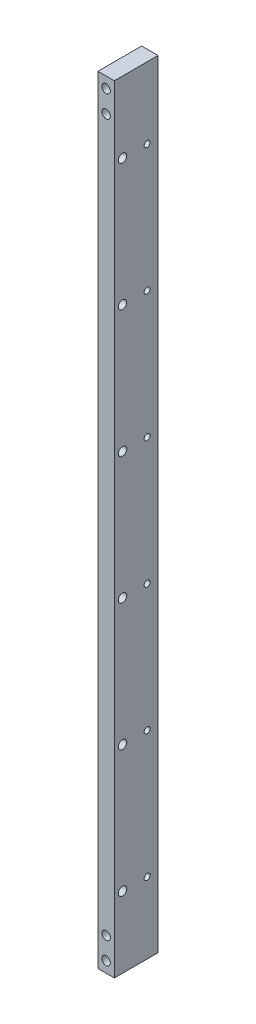
ISO-10303-21;
HEADER;
FILE_DESCRIPTION(('STEP AP214'),'2;1');
FILE_NAME('part.step','',(''),(''),'','','');
FILE_SCHEMA(('AUTOMOTIVE_DESIGN { 1 0 10303 214 1 1 1 1 }'));
ENDSEC;
DATA;
#1=APPLICATION_CONTEXT('core data for automotive mechanical design processes');
#2=APPLICATION_PROTOCOL_DEFINITION('international standard','automotive_design',2000,#1);
#3=PRODUCT_CONTEXT('',#1,'mechanical');
#4=PRODUCT('Part','Part','',(#3));
#5=PRODUCT_RELATED_PRODUCT_CATEGORY('part','',(#4));
#6=PRODUCT_DEFINITION_FORMATION('','',#4);
#7=PRODUCT_DEFINITION_CONTEXT('part definition',#1,'design');
#8=PRODUCT_DEFINITION('design','',#6,#7);
#9=PRODUCT_DEFINITION_SHAPE('','',#8);
#10=(LENGTH_UNIT() NAMED_UNIT(*) SI_UNIT(.MILLI.,.METRE.));
#11=(NAMED_UNIT(*) PLANE_ANGLE_UNIT() SI_UNIT($,.RADIAN.));
#12=(NAMED_UNIT(*) SI_UNIT($,.STERADIAN.) SOLID_ANGLE_UNIT());
#13=UNCERTAINTY_MEASURE_WITH_UNIT(LENGTH_MEASURE(1.E-05),#10,'distance_accuracy_value','');
#14=(GEOMETRIC_REPRESENTATION_CONTEXT(3) GLOBAL_UNCERTAINTY_ASSIGNED_CONTEXT((#13)) GLOBAL_UNIT_ASSIGNED_CONTEXT((#10,
#11,#12)) REPRESENTATION_CONTEXT('',''));
#15=CARTESIAN_POINT('',(0.,0.,0.));
#16=DIRECTION('',(0.,0.,1.));
#17=DIRECTION('',(1.,0.,0.));
#18=AXIS2_PLACEMENT_3D('',#15,#16,#17);
#19=CARTESIAN_POINT('',(-12.9743902977286,450.85,-10.5416921169045));
#20=DIRECTION('',(1.,0.,0.));
#21=DIRECTION('',(0.,0.,-1.));
#22=AXIS2_PLACEMENT_3D('',#19,#20,#21);
#23=PLANE('',#22);
#24=CARTESIAN_POINT('',(-12.9743902977286,41.275,-4.19169211690451));
#25=DIRECTION('',(-1.,0.,0.));
#26=DIRECTION('',(0.,0.,1.));
#27=AXIS2_PLACEMENT_3D('',#24,#25,#26);
#28=CIRCLE('',#27,1.72719999999998);
#29=CARTESIAN_POINT('',(-12.9743902977286,41.275,-2.46449211690452));
#30=VERTEX_POINT('',#29);
#31=EDGE_CURVE('E266',#30,#30,#28,.T.);
#32=ORIENTED_EDGE('',*,*,#31,.F.);
#33=EDGE_LOOP('',(#32));
#34=FACE_BOUND('',#33,.T.);
#35=CARTESIAN_POINT('',(-12.9743902977286,114.935,-4.19169211690451));
#36=DIRECTION('',(-1.,0.,0.));
#37=DIRECTION('',(0.,0.,1.));
#38=AXIS2_PLACEMENT_3D('',#35,#36,#37);
#39=CIRCLE('',#38,1.72719999999998);
#40=CARTESIAN_POINT('',(-12.9743902977286,114.935,-2.46449211690452));
#41=VERTEX_POINT('',#40);
#42=EDGE_CURVE('E260',#41,#41,#39,.T.);
#43=ORIENTED_EDGE('',*,*,#42,.F.);
#44=EDGE_LOOP('',(#43));
#45=FACE_BOUND('',#44,.T.);
#46=CARTESIAN_POINT('',(-12.9743902977286,188.595,-4.19169211690451));
#47=DIRECTION('',(-1.,0.,0.));
#48=DIRECTION('',(0.,0.,1.));
#49=AXIS2_PLACEMENT_3D('',#46,#47,#48);
#50=CIRCLE('',#49,1.72719999999998);
#51=CARTESIAN_POINT('',(-12.9743902977286,188.595,-2.46449211690452));
#52=VERTEX_POINT('',#51);
#53=EDGE_CURVE('E254',#52,#52,#50,.T.);
#54=ORIENTED_EDGE('',*,*,#53,.F.);
#55=EDGE_LOOP('',(#54));
#56=FACE_BOUND('',#55,.T.);
#57=CARTESIAN_POINT('',(-12.9743902977286,262.255,-4.19169211690451));
#58=DIRECTION('',(-1.,0.,0.));
#59=DIRECTION('',(0.,0.,1.));
#60=AXIS2_PLACEMENT_3D('',#57,#58,#59);
#61=CIRCLE('',#60,1.72719999999998);
#62=CARTESIAN_POINT('',(-12.9743902977286,262.255,-2.46449211690452));
#63=VERTEX_POINT('',#62);
#64=EDGE_CURVE('E248',#63,#63,#61,.T.);
#65=ORIENTED_EDGE('',*,*,#64,.F.);
#66=EDGE_LOOP('',(#65));
#67=FACE_BOUND('',#66,.T.);
#68=CARTESIAN_POINT('',(-12.9743902977286,335.915,-4.19169211690451));
#69=DIRECTION('',(-1.,0.,0.));
#70=DIRECTION('',(0.,0.,1.));
#71=AXIS2_PLACEMENT_3D('',#68,#69,#70);
#72=CIRCLE('',#71,1.72719999999998);
#73=CARTESIAN_POINT('',(-12.9743902977286,335.915,-2.46449211690452));
#74=VERTEX_POINT('',#73);
#75=EDGE_CURVE('E242',#74,#74,#72,.T.);
#76=ORIENTED_EDGE('',*,*,#75,.F.);
#77=EDGE_LOOP('',(#76));
#78=FACE_BOUND('',#77,.T.);
#79=CARTESIAN_POINT('',(-12.9743902977286,409.575,-4.19169211690451));
#80=DIRECTION('',(-1.,0.,0.));
#81=DIRECTION('',(0.,0.,1.));
#82=AXIS2_PLACEMENT_3D('',#79,#80,#81);
#83=CIRCLE('',#82,1.72719999999998);
#84=CARTESIAN_POINT('',(-12.9743902977286,409.575,-2.46449211690452));
#85=VERTEX_POINT('',#84);
#86=EDGE_CURVE('E236',#85,#85,#83,.T.);
#87=ORIENTED_EDGE('',*,*,#86,.F.);
#88=EDGE_LOOP('',(#87));
#89=FACE_BOUND('',#88,.T.);
#90=CARTESIAN_POINT('',(-12.9743902977286,41.275,10.0958078830955));
#91=DIRECTION('',(-1.,0.,0.));
#92=DIRECTION('',(0.,0.,1.));
#93=AXIS2_PLACEMENT_3D('',#90,#91,#92);
#94=CIRCLE('',#93,3.96875);
#95=CARTESIAN_POINT('',(-12.9743902977286,41.275,14.0645578830955));
#96=VERTEX_POINT('',#95);
#97=EDGE_CURVE('E182',#96,#96,#94,.T.);
#98=ORIENTED_EDGE('',*,*,#97,.F.);
#99=EDGE_LOOP('',(#98));
#100=FACE_BOUND('',#99,.T.);
#101=CARTESIAN_POINT('',(-12.9743902977286,114.935,10.0958078830955));
#102=DIRECTION('',(-1.,0.,0.));
#103=DIRECTION('',(0.,0.,1.));
#104=AXIS2_PLACEMENT_3D('',#101,#102,#103);
#105=CIRCLE('',#104,3.96874999999999);
#106=CARTESIAN_POINT('',(-12.9743902977286,114.935,14.0645578830955));
#107=VERTEX_POINT('',#106);
#108=EDGE_CURVE('E170',#107,#107,#105,.T.);
#109=ORIENTED_EDGE('',*,*,#108,.F.);
#110=EDGE_LOOP('',(#109));
#111=FACE_BOUND('',#110,.T.);
#112=CARTESIAN_POINT('',(-12.9743902977286,188.595,10.0958078830955));
#113=DIRECTION('',(-1.,0.,0.));
#114=DIRECTION('',(0.,0.,1.));
#115=AXIS2_PLACEMENT_3D('',#112,#113,#114);
#116=CIRCLE('',#115,3.96874999999999);
#117=CARTESIAN_POINT('',(-12.9743902977286,188.595,14.0645578830955));
#118=VERTEX_POINT('',#117);
#119=EDGE_CURVE('E158',#118,#118,#116,.T.);
#120=ORIENTED_EDGE('',*,*,#119,.F.);
#121=EDGE_LOOP('',(#120));
#122=FACE_BOUND('',#121,.T.);
#123=CARTESIAN_POINT('',(-12.9743902977286,262.255,10.0958078830955));
#124=DIRECTION('',(-1.,0.,0.));
#125=DIRECTION('',(0.,0.,1.));
#126=AXIS2_PLACEMENT_3D('',#123,#124,#125);
#127=CIRCLE('',#126,3.96875000000002);
#128=CARTESIAN_POINT('',(-12.9743902977286,262.255,14.0645578830955));
#129=VERTEX_POINT('',#128);
#130=EDGE_CURVE('E146',#129,#129,#127,.T.);
#131=ORIENTED_EDGE('',*,*,#130,.F.);
#132=EDGE_LOOP('',(#131));
#133=FACE_BOUND('',#132,.T.);
#134=CARTESIAN_POINT('',(-12.9743902977286,335.915,10.0958078830955));
#135=DIRECTION('',(-1.,0.,0.));
#136=DIRECTION('',(0.,0.,1.));
#137=AXIS2_PLACEMENT_3D('',#134,#135,#136);
#138=CIRCLE('',#137,3.96875000000002);
#139=CARTESIAN_POINT('',(-12.9743902977286,335.915,14.0645578830955));
#140=VERTEX_POINT('',#139);
#141=EDGE_CURVE('E134',#140,#140,#138,.T.);
#142=ORIENTED_EDGE('',*,*,#141,.F.);
#143=EDGE_LOOP('',(#142));
#144=FACE_BOUND('',#143,.T.);
#145=CARTESIAN_POINT('',(-12.9743902977286,409.575,10.0958078830955));
#146=DIRECTION('',(-1.,0.,0.));
#147=DIRECTION('',(0.,0.,1.));
#148=AXIS2_PLACEMENT_3D('',#145,#146,#147);
#149=CIRCLE('',#148,3.96875000000002);
#150=CARTESIAN_POINT('',(-12.9743902977286,409.575,14.0645578830955));
#151=VERTEX_POINT('',#150);
#152=EDGE_CURVE('E122',#151,#151,#149,.T.);
#153=ORIENTED_EDGE('',*,*,#152,.F.);
#154=EDGE_LOOP('',(#153));
#155=FACE_BOUND('',#154,.T.);
#156=DIRECTION('',(0.,0.,1.));
#157=VECTOR('',#156,1.);
#158=CARTESIAN_POINT('',(-12.9743902977286,0.,-10.5416921169045));
#159=LINE('',#158,#157);
#160=CARTESIAN_POINT('',(-12.9743902977286,0.,-10.5416921169045));
#161=VERTEX_POINT('',#160);
#162=CARTESIAN_POINT('',(-12.9743902977286,0.,14.8583078830955));
#163=VERTEX_POINT('',#162);
#164=EDGE_CURVE('E100',#161,#163,#159,.T.);
#165=ORIENTED_EDGE('',*,*,#164,.T.);
#166=DIRECTION('',(0.,-1.,0.));
#167=VECTOR('',#166,1.);
#168=CARTESIAN_POINT('',(-12.9743902977286,450.85,14.8583078830955));
#169=LINE('',#168,#167);
#170=CARTESIAN_POINT('',(-12.9743902977286,450.85,14.8583078830955));
#171=VERTEX_POINT('',#170);
#172=EDGE_CURVE('E11',#171,#163,#169,.T.);
#173=ORIENTED_EDGE('',*,*,#172,.F.);
#174=DIRECTION('',(0.,0.,1.));
#175=VECTOR('',#174,1.);
#176=CARTESIAN_POINT('',(-12.9743902977286,450.85,-10.5416921169045));
#177=LINE('',#176,#175);
#178=CARTESIAN_POINT('',(-12.9743902977286,450.85,-10.5416921169045));
#179=VERTEX_POINT('',#178);
#180=EDGE_CURVE('E88',#179,#171,#177,.T.);
#181=ORIENTED_EDGE('',*,*,#180,.F.);
#182=DIRECTION('',(0.,-1.,0.));
#183=VECTOR('',#182,1.);
#184=CARTESIAN_POINT('',(-12.9743902977286,450.85,-10.5416921169045));
#185=LINE('',#184,#183);
#186=EDGE_CURVE('E96',#179,#161,#185,.T.);
#187=ORIENTED_EDGE('',*,*,#186,.T.);
#188=EDGE_LOOP('',(#165,#173,#181,#187));
#189=FACE_BOUND('',#188,.T.);
#190=ADVANCED_FACE('F37',(#34,#45,#56,#67,#78,#89,#100,#111,#122,#133,#144,#155,#189),#23,.F.);
#191=CARTESIAN_POINT('',(-12.9743902977286,450.85,14.8583078830955));
#192=DIRECTION('',(0.,0.,-1.));
#193=DIRECTION('',(-1.,0.,0.));
#194=AXIS2_PLACEMENT_3D('',#191,#192,#193);
#195=PLANE('',#194);
#196=CARTESIAN_POINT('',(-8.21189029772862,6.35,14.8583078830955));
#197=DIRECTION('',(0.,0.,-1.));
#198=DIRECTION('',(-1.,0.,0.));
#199=AXIS2_PLACEMENT_3D('',#196,#197,#198);
#200=CIRCLE('',#199,2.45744999999999);
#201=CARTESIAN_POINT('',(-10.6693402977286,6.35,14.8583078830955));
#202=VERTEX_POINT('',#201);
#203=EDGE_CURVE('E221',#202,#202,#200,.T.);
#204=ORIENTED_EDGE('',*,*,#203,.T.);
#205=EDGE_LOOP('',(#204));
#206=FACE_BOUND('',#205,.T.);
#207=CARTESIAN_POINT('',(-8.21189029772862,19.05,14.8583078830955));
#208=DIRECTION('',(0.,0.,-1.));
#209=DIRECTION('',(-1.,0.,0.));
#210=AXIS2_PLACEMENT_3D('',#207,#208,#209);
#211=CIRCLE('',#210,2.45744999999999);
#212=CARTESIAN_POINT('',(-10.6693402977286,19.05,14.8583078830955));
#213=VERTEX_POINT('',#212);
#214=EDGE_CURVE('E209',#213,#213,#211,.T.);
#215=ORIENTED_EDGE('',*,*,#214,.T.);
#216=EDGE_LOOP('',(#215));
#217=FACE_BOUND('',#216,.T.);
#218=CARTESIAN_POINT('',(-8.21189029772862,431.8,14.8583078830955));
#219=DIRECTION('',(0.,0.,-1.));
#220=DIRECTION('',(-1.,0.,0.));
#221=AXIS2_PLACEMENT_3D('',#218,#219,#220);
#222=CIRCLE('',#221,2.45744999999999);
#223=CARTESIAN_POINT('',(-10.6693402977286,431.8,14.8583078830955));
#224=VERTEX_POINT('',#223);
#225=EDGE_CURVE('E197',#224,#224,#222,.T.);
#226=ORIENTED_EDGE('',*,*,#225,.T.);
#227=EDGE_LOOP('',(#226));
#228=FACE_BOUND('',#227,.T.);
#229=CARTESIAN_POINT('',(-8.21189029772862,444.5,14.8583078830955));
#230=DIRECTION('',(0.,0.,-1.));
#231=DIRECTION('',(-1.,0.,0.));
#232=AXIS2_PLACEMENT_3D('',#229,#230,#231);
#233=CIRCLE('',#232,2.45744999999999);
#234=CARTESIAN_POINT('',(-10.6693402977286,444.5,14.8583078830955));
#235=VERTEX_POINT('',#234);
#236=EDGE_CURVE('E185',#235,#235,#233,.T.);
#237=ORIENTED_EDGE('',*,*,#236,.T.);
#238=EDGE_LOOP('',(#237));
#239=FACE_BOUND('',#238,.T.);
#240=DIRECTION('',(1.,0.,0.));
#241=VECTOR('',#240,1.);
#242=CARTESIAN_POINT('',(-12.9743902977286,0.,14.8583078830955));
#243=LINE('',#242,#241);
#244=CARTESIAN_POINT('',(-3.44939029772862,0.,14.8583078830955));
#245=VERTEX_POINT('',#244);
#246=EDGE_CURVE('E92',#163,#245,#243,.T.);
#247=ORIENTED_EDGE('',*,*,#246,.T.);
#248=DIRECTION('',(0.,-1.,0.));
#249=VECTOR('',#248,1.);
#250=CARTESIAN_POINT('',(-3.44939029772862,450.85,14.8583078830955));
#251=LINE('',#250,#249);
#252=CARTESIAN_POINT('',(-3.44939029772862,450.85,14.8583078830955));
#253=VERTEX_POINT('',#252);
#254=EDGE_CURVE('E45',#253,#245,#251,.T.);
#255=ORIENTED_EDGE('',*,*,#254,.F.);
#256=DIRECTION('',(1.,0.,0.));
#257=VECTOR('',#256,1.);
#258=CARTESIAN_POINT('',(-12.9743902977286,450.85,14.8583078830955));
#259=LINE('',#258,#257);
#260=EDGE_CURVE('E83',#171,#253,#259,.T.);
#261=ORIENTED_EDGE('',*,*,#260,.F.);
#262=ORIENTED_EDGE('',*,*,#172,.T.);
#263=EDGE_LOOP('',(#247,#255,#261,#262));
#264=FACE_BOUND('',#263,.T.);
#265=ADVANCED_FACE('F91',(#206,#217,#228,#239,#264),#195,.F.);
#266=CARTESIAN_POINT('',(-3.44939029772863,450.85,-10.5416921169045));
#267=DIRECTION('',(-1.,0.,0.));
#268=DIRECTION('',(0.,0.,1.));
#269=AXIS2_PLACEMENT_3D('',#266,#267,#268);
#270=PLANE('',#269);
#271=CARTESIAN_POINT('',(-3.44939029772861,41.275,-4.19169211690451));
#272=DIRECTION('',(-1.,0.,0.));
#273=DIRECTION('',(0.,0.,1.));
#274=AXIS2_PLACEMENT_3D('',#271,#272,#273);
#275=CIRCLE('',#274,1.7272);
#276=CARTESIAN_POINT('',(-3.44939029772861,41.275,-2.46449211690451));
#277=VERTEX_POINT('',#276);
#278=EDGE_CURVE('E263',#277,#277,#275,.T.);
#279=ORIENTED_EDGE('',*,*,#278,.T.);
#280=EDGE_LOOP('',(#279));
#281=FACE_BOUND('',#280,.T.);
#282=CARTESIAN_POINT('',(-3.44939029772861,114.935,-4.19169211690451));
#283=DIRECTION('',(-1.,0.,0.));
#284=DIRECTION('',(0.,0.,1.));
#285=AXIS2_PLACEMENT_3D('',#282,#283,#284);
#286=CIRCLE('',#285,1.7272);
#287=CARTESIAN_POINT('',(-3.44939029772861,114.935,-2.46449211690451));
#288=VERTEX_POINT('',#287);
#289=EDGE_CURVE('E257',#288,#288,#286,.T.);
#290=ORIENTED_EDGE('',*,*,#289,.T.);
#291=EDGE_LOOP('',(#290));
#292=FACE_BOUND('',#291,.T.);
#293=CARTESIAN_POINT('',(-3.44939029772861,188.595,-4.19169211690451));
#294=DIRECTION('',(-1.,0.,0.));
#295=DIRECTION('',(0.,0.,1.));
#296=AXIS2_PLACEMENT_3D('',#293,#294,#295);
#297=CIRCLE('',#296,1.72719999999998);
#298=CARTESIAN_POINT('',(-3.44939029772861,188.595,-2.46449211690452));
#299=VERTEX_POINT('',#298);
#300=EDGE_CURVE('E251',#299,#299,#297,.T.);
#301=ORIENTED_EDGE('',*,*,#300,.T.);
#302=EDGE_LOOP('',(#301));
#303=FACE_BOUND('',#302,.T.);
#304=CARTESIAN_POINT('',(-3.44939029772861,262.255,-4.19169211690451));
#305=DIRECTION('',(-1.,0.,0.));
#306=DIRECTION('',(0.,0.,1.));
#307=AXIS2_PLACEMENT_3D('',#304,#305,#306);
#308=CIRCLE('',#307,1.72719999999998);
#309=CARTESIAN_POINT('',(-3.44939029772861,262.255,-2.46449211690452));
#310=VERTEX_POINT('',#309);
#311=EDGE_CURVE('E245',#310,#310,#308,.T.);
#312=ORIENTED_EDGE('',*,*,#311,.T.);
#313=EDGE_LOOP('',(#312));
#314=FACE_BOUND('',#313,.T.);
#315=CARTESIAN_POINT('',(-3.44939029772861,335.915,-4.19169211690451));
#316=DIRECTION('',(-1.,0.,0.));
#317=DIRECTION('',(0.,0.,1.));
#318=AXIS2_PLACEMENT_3D('',#315,#316,#317);
#319=CIRCLE('',#318,1.72719999999998);
#320=CARTESIAN_POINT('',(-3.44939029772861,335.915,-2.46449211690452));
#321=VERTEX_POINT('',#320);
#322=EDGE_CURVE('E239',#321,#321,#319,.T.);
#323=ORIENTED_EDGE('',*,*,#322,.T.);
#324=EDGE_LOOP('',(#323));
#325=FACE_BOUND('',#324,.T.);
#326=CARTESIAN_POINT('',(-3.44939029772861,409.575,-4.19169211690451));
#327=DIRECTION('',(-1.,0.,0.));
#328=DIRECTION('',(0.,0.,1.));
#329=AXIS2_PLACEMENT_3D('',#326,#327,#328);
#330=CIRCLE('',#329,1.72719999999998);
#331=CARTESIAN_POINT('',(-3.44939029772861,409.575,-2.46449211690452));
#332=VERTEX_POINT('',#331);
#333=EDGE_CURVE('E233',#332,#332,#330,.T.);
#334=ORIENTED_EDGE('',*,*,#333,.T.);
#335=EDGE_LOOP('',(#334));
#336=FACE_BOUND('',#335,.T.);
#337=CARTESIAN_POINT('',(-3.44939029772861,41.275,10.0958078830955));
#338=DIRECTION('',(-1.,0.,0.));
#339=DIRECTION('',(0.,0.,1.));
#340=AXIS2_PLACEMENT_3D('',#337,#338,#339);
#341=CIRCLE('',#340,2.45745);
#342=CARTESIAN_POINT('',(-3.44939029772861,41.275,12.5532578830955));
#343=VERTEX_POINT('',#342);
#344=EDGE_CURVE('E173',#343,#343,#341,.T.);
#345=ORIENTED_EDGE('',*,*,#344,.T.);
#346=EDGE_LOOP('',(#345));
#347=FACE_BOUND('',#346,.T.);
#348=CARTESIAN_POINT('',(-3.44939029772861,114.935,10.0958078830955));
#349=DIRECTION('',(-1.,0.,0.));
#350=DIRECTION('',(0.,0.,1.));
#351=AXIS2_PLACEMENT_3D('',#348,#349,#350);
#352=CIRCLE('',#351,2.45745);
#353=CARTESIAN_POINT('',(-3.44939029772861,114.935,12.5532578830955));
#354=VERTEX_POINT('',#353);
#355=EDGE_CURVE('E161',#354,#354,#352,.T.);
#356=ORIENTED_EDGE('',*,*,#355,.T.);
#357=EDGE_LOOP('',(#356));
#358=FACE_BOUND('',#357,.T.);
#359=CARTESIAN_POINT('',(-3.44939029772861,188.595,10.0958078830955));
#360=DIRECTION('',(-1.,0.,0.));
#361=DIRECTION('',(0.,0.,1.));
#362=AXIS2_PLACEMENT_3D('',#359,#360,#361);
#363=CIRCLE('',#362,2.45745);
#364=CARTESIAN_POINT('',(-3.44939029772861,188.595,12.5532578830955));
#365=VERTEX_POINT('',#364);
#366=EDGE_CURVE('E149',#365,#365,#363,.T.);
#367=ORIENTED_EDGE('',*,*,#366,.T.);
#368=EDGE_LOOP('',(#367));
#369=FACE_BOUND('',#368,.T.);
#370=CARTESIAN_POINT('',(-3.44939029772861,262.255,10.0958078830955));
#371=DIRECTION('',(-1.,0.,0.));
#372=DIRECTION('',(0.,0.,1.));
#373=AXIS2_PLACEMENT_3D('',#370,#371,#372);
#374=CIRCLE('',#373,2.45744999999997);
#375=CARTESIAN_POINT('',(-3.44939029772861,262.255,12.5532578830955));
#376=VERTEX_POINT('',#375);
#377=EDGE_CURVE('E137',#376,#376,#374,.T.);
#378=ORIENTED_EDGE('',*,*,#377,.T.);
#379=EDGE_LOOP('',(#378));
#380=FACE_BOUND('',#379,.T.);
#381=CARTESIAN_POINT('',(-3.44939029772861,335.915,10.0958078830955));
#382=DIRECTION('',(-1.,0.,0.));
#383=DIRECTION('',(0.,0.,1.));
#384=AXIS2_PLACEMENT_3D('',#381,#382,#383);
#385=CIRCLE('',#384,2.45744999999997);
#386=CARTESIAN_POINT('',(-3.44939029772861,335.915,12.5532578830955));
#387=VERTEX_POINT('',#386);
#388=EDGE_CURVE('E125',#387,#387,#385,.T.);
#389=ORIENTED_EDGE('',*,*,#388,.T.);
#390=EDGE_LOOP('',(#389));
#391=FACE_BOUND('',#390,.T.);
#392=CARTESIAN_POINT('',(-3.44939029772861,409.575,10.0958078830955));
#393=DIRECTION('',(-1.,0.,0.));
#394=DIRECTION('',(0.,0.,1.));
#395=AXIS2_PLACEMENT_3D('',#392,#393,#394);
#396=CIRCLE('',#395,2.45744999999997);
#397=CARTESIAN_POINT('',(-3.44939029772861,409.575,12.5532578830955));
#398=VERTEX_POINT('',#397);
#399=EDGE_CURVE('E103',#398,#398,#396,.T.);
#400=ORIENTED_EDGE('',*,*,#399,.T.);
#401=EDGE_LOOP('',(#400));
#402=FACE_BOUND('',#401,.T.);
#403=DIRECTION('',(0.,0.,-1.));
#404=VECTOR('',#403,1.);
#405=CARTESIAN_POINT('',(-3.44939029772863,0.,-10.5416921169045));
#406=LINE('',#405,#404);
#407=CARTESIAN_POINT('',(-3.44939029772863,0.,-10.5416921169045));
#408=VERTEX_POINT('',#407);
#409=EDGE_CURVE('E70',#245,#408,#406,.T.);
#410=ORIENTED_EDGE('',*,*,#409,.T.);
#411=DIRECTION('',(0.,-1.,0.));
#412=VECTOR('',#411,1.);
#413=CARTESIAN_POINT('',(-3.44939029772863,450.85,-10.5416921169045));
#414=LINE('',#413,#412);
#415=CARTESIAN_POINT('',(-3.44939029772863,450.85,-10.5416921169045));
#416=VERTEX_POINT('',#415);
#417=EDGE_CURVE('E93',#416,#408,#414,.T.);
#418=ORIENTED_EDGE('',*,*,#417,.F.);
#419=DIRECTION('',(0.,0.,-1.));
#420=VECTOR('',#419,1.);
#421=CARTESIAN_POINT('',(-3.44939029772863,450.85,-10.5416921169045));
#422=LINE('',#421,#420);
#423=EDGE_CURVE('E86',#253,#416,#422,.T.);
#424=ORIENTED_EDGE('',*,*,#423,.F.);
#425=ORIENTED_EDGE('',*,*,#254,.T.);
#426=EDGE_LOOP('',(#410,#418,#424,#425));
#427=FACE_BOUND('',#426,.T.);
#428=ADVANCED_FACE('F94',(#281,#292,#303,#314,#325,#336,#347,#358,#369,#380,#391,#402,#427),
#270,.F.);
#429=CARTESIAN_POINT('',(-12.9743902977286,450.85,-10.5416921169045));
#430=DIRECTION('',(0.,0.,1.));
#431=DIRECTION('',(1.,0.,0.));
#432=AXIS2_PLACEMENT_3D('',#429,#430,#431);
#433=PLANE('',#432);
#434=CARTESIAN_POINT('',(-8.21189029772862,6.35,-10.5416921169045));
#435=DIRECTION('',(0.,0.,-1.));
#436=DIRECTION('',(-1.,0.,0.));
#437=AXIS2_PLACEMENT_3D('',#434,#435,#436);
#438=CIRCLE('',#437,3.96875);
#439=CARTESIAN_POINT('',(-12.1806402977286,6.35,-10.5416921169045));
#440=VERTEX_POINT('',#439);
#441=EDGE_CURVE('E230',#440,#440,#438,.T.);
#442=ORIENTED_EDGE('',*,*,#441,.F.);
#443=EDGE_LOOP('',(#442));
#444=FACE_BOUND('',#443,.T.);
#445=CARTESIAN_POINT('',(-8.21189029772862,19.05,-10.5416921169045));
#446=DIRECTION('',(0.,0.,-1.));
#447=DIRECTION('',(-1.,0.,0.));
#448=AXIS2_PLACEMENT_3D('',#445,#446,#447);
#449=CIRCLE('',#448,3.96875);
#450=CARTESIAN_POINT('',(-12.1806402977286,19.05,-10.5416921169045));
#451=VERTEX_POINT('',#450);
#452=EDGE_CURVE('E218',#451,#451,#449,.T.);
#453=ORIENTED_EDGE('',*,*,#452,.F.);
#454=EDGE_LOOP('',(#453));
#455=FACE_BOUND('',#454,.T.);
#456=CARTESIAN_POINT('',(-8.21189029772862,431.8,-10.5416921169045));
#457=DIRECTION('',(0.,0.,-1.));
#458=DIRECTION('',(-1.,0.,0.));
#459=AXIS2_PLACEMENT_3D('',#456,#457,#458);
#460=CIRCLE('',#459,3.96875);
#461=CARTESIAN_POINT('',(-12.1806402977286,431.8,-10.5416921169045));
#462=VERTEX_POINT('',#461);
#463=EDGE_CURVE('E206',#462,#462,#460,.T.);
#464=ORIENTED_EDGE('',*,*,#463,.F.);
#465=EDGE_LOOP('',(#464));
#466=FACE_BOUND('',#465,.T.);
#467=CARTESIAN_POINT('',(-8.21189029772862,444.5,-10.5416921169045));
#468=DIRECTION('',(0.,0.,-1.));
#469=DIRECTION('',(-1.,0.,0.));
#470=AXIS2_PLACEMENT_3D('',#467,#468,#469);
#471=CIRCLE('',#470,3.96875);
#472=CARTESIAN_POINT('',(-12.1806402977286,444.5,-10.5416921169045));
#473=VERTEX_POINT('',#472);
#474=EDGE_CURVE('E194',#473,#473,#471,.T.);
#475=ORIENTED_EDGE('',*,*,#474,.F.);
#476=EDGE_LOOP('',(#475));
#477=FACE_BOUND('',#476,.T.);
#478=DIRECTION('',(-1.,0.,0.));
#479=VECTOR('',#478,1.);
#480=CARTESIAN_POINT('',(-12.9743902977286,0.,-10.5416921169045));
#481=LINE('',#480,#479);
#482=EDGE_CURVE('E76',#408,#161,#481,.T.);
#483=ORIENTED_EDGE('',*,*,#482,.T.);
#484=ORIENTED_EDGE('',*,*,#186,.F.);
#485=DIRECTION('',(-1.,0.,0.));
#486=VECTOR('',#485,1.);
#487=CARTESIAN_POINT('',(-12.9743902977286,450.85,-10.5416921169045));
#488=LINE('',#487,#486);
#489=EDGE_CURVE('E53',#416,#179,#488,.T.);
#490=ORIENTED_EDGE('',*,*,#489,.F.);
#491=ORIENTED_EDGE('',*,*,#417,.T.);
#492=EDGE_LOOP('',(#483,#484,#490,#491));
#493=FACE_BOUND('',#492,.T.);
#494=ADVANCED_FACE('F108',(#444,#455,#466,#477,#493),#433,.F.);
#495=CARTESIAN_POINT('',(0.,450.85,0.));
#496=DIRECTION('',(0.,1.,0.));
#497=DIRECTION('',(0.,0.,1.));
#498=AXIS2_PLACEMENT_3D('',#495,#496,#497);
#499=PLANE('',#498);
#500=ORIENTED_EDGE('',*,*,#180,.T.);
#501=ORIENTED_EDGE('',*,*,#260,.T.);
#502=ORIENTED_EDGE('',*,*,#423,.T.);
#503=ORIENTED_EDGE('',*,*,#489,.T.);
#504=EDGE_LOOP('',(#500,#501,#502,#503));
#505=FACE_BOUND('',#504,.T.);
#506=ADVANCED_FACE('F84',(#505),#499,.T.);
#507=CARTESIAN_POINT('',(0.,0.,0.));
#508=DIRECTION('',(0.,1.,0.));
#509=DIRECTION('',(0.,0.,1.));
#510=AXIS2_PLACEMENT_3D('',#507,#508,#509);
#511=PLANE('',#510);
#512=ORIENTED_EDGE('',*,*,#164,.F.);
#513=ORIENTED_EDGE('',*,*,#482,.F.);
#514=ORIENTED_EDGE('',*,*,#409,.F.);
#515=ORIENTED_EDGE('',*,*,#246,.F.);
#516=EDGE_LOOP('',(#512,#513,#514,#515));
#517=FACE_BOUND('',#516,.T.);
#518=ADVANCED_FACE('F111',(#517),#511,.F.);
#519=CARTESIAN_POINT('',(-12.9743902977286,409.575,10.0958078830955));
#520=DIRECTION('',(-1.,0.,0.));
#521=DIRECTION('',(0.,0.,1.));
#522=AXIS2_PLACEMENT_3D('',#519,#520,#521);
#523=CYLINDRICAL_SURFACE('',#522,2.45744999999997);
#524=ORIENTED_EDGE('',*,*,#399,.F.);
#525=EDGE_LOOP('',(#524));
#526=FACE_BOUND('',#525,.T.);
#527=CARTESIAN_POINT('',(-7.53879029772862,409.575,10.0958078830955));
#528=DIRECTION('',(-1.,0.,0.));
#529=DIRECTION('',(0.,0.,1.));
#530=AXIS2_PLACEMENT_3D('',#527,#528,#529);
#531=CIRCLE('',#530,2.45744999999997);
#532=CARTESIAN_POINT('',(-7.53879029772862,409.575,12.5532578830955));
#533=VERTEX_POINT('',#532);
#534=EDGE_CURVE('E116',#533,#533,#531,.T.);
#535=ORIENTED_EDGE('',*,*,#534,.T.);
#536=EDGE_LOOP('',(#535));
#537=FACE_BOUND('',#536,.T.);
#538=ADVANCED_FACE('F309',(#526,#537),#523,.F.);
#539=CARTESIAN_POINT('',(-7.53879029772862,412.03245,10.0958078830955));
#540=DIRECTION('',(1.,0.,0.));
#541=DIRECTION('',(0.,0.,-1.));
#542=AXIS2_PLACEMENT_3D('',#539,#540,#541);
#543=PLANE('',#542);
#544=ORIENTED_EDGE('',*,*,#534,.F.);
#545=EDGE_LOOP('',(#544));
#546=FACE_BOUND('',#545,.T.);
#547=CARTESIAN_POINT('',(-7.53879029772862,409.575,10.0958078830955));
#548=DIRECTION('',(-1.,0.,0.));
#549=DIRECTION('',(0.,0.,1.));
#550=AXIS2_PLACEMENT_3D('',#547,#548,#549);
#551=CIRCLE('',#550,3.96875000000002);
#552=CARTESIAN_POINT('',(-7.53879029772862,409.575,14.0645578830955));
#553=VERTEX_POINT('',#552);
#554=EDGE_CURVE('E119',#553,#553,#551,.T.);
#555=ORIENTED_EDGE('',*,*,#554,.T.);
#556=EDGE_LOOP('',(#555));
#557=FACE_BOUND('',#556,.T.);
#558=ADVANCED_FACE('F299',(#546,#557),#543,.F.);
#559=CARTESIAN_POINT('',(-12.9743902977286,409.575,10.0958078830955));
#560=DIRECTION('',(-1.,0.,0.));
#561=DIRECTION('',(0.,0.,1.));
#562=AXIS2_PLACEMENT_3D('',#559,#560,#561);
#563=CYLINDRICAL_SURFACE('',#562,3.96875000000002);
#564=ORIENTED_EDGE('',*,*,#554,.F.);
#565=EDGE_LOOP('',(#564));
#566=FACE_BOUND('',#565,.T.);
#567=ORIENTED_EDGE('',*,*,#152,.T.);
#568=EDGE_LOOP('',(#567));
#569=FACE_BOUND('',#568,.T.);
#570=ADVANCED_FACE('F296',(#566,#569),#563,.F.);
#571=CARTESIAN_POINT('',(-12.9743902977286,335.915,10.0958078830955));
#572=DIRECTION('',(-1.,0.,0.));
#573=DIRECTION('',(0.,0.,1.));
#574=AXIS2_PLACEMENT_3D('',#571,#572,#573);
#575=CYLINDRICAL_SURFACE('',#574,2.45744999999997);
#576=ORIENTED_EDGE('',*,*,#388,.F.);
#577=EDGE_LOOP('',(#576));
#578=FACE_BOUND('',#577,.T.);
#579=CARTESIAN_POINT('',(-7.53879029772862,335.915,10.0958078830955));
#580=DIRECTION('',(-1.,0.,0.));
#581=DIRECTION('',(0.,0.,1.));
#582=AXIS2_PLACEMENT_3D('',#579,#580,#581);
#583=CIRCLE('',#582,2.45744999999997);
#584=CARTESIAN_POINT('',(-7.53879029772862,335.915,12.5532578830955));
#585=VERTEX_POINT('',#584);
#586=EDGE_CURVE('E128',#585,#585,#583,.T.);
#587=ORIENTED_EDGE('',*,*,#586,.T.);
#588=EDGE_LOOP('',(#587));
#589=FACE_BOUND('',#588,.T.);
#590=ADVANCED_FACE('F298',(#578,#589),#575,.F.);
#591=CARTESIAN_POINT('',(-7.53879029772862,338.37245,10.0958078830955));
#592=DIRECTION('',(1.,0.,0.));
#593=DIRECTION('',(0.,0.,-1.));
#594=AXIS2_PLACEMENT_3D('',#591,#592,#593);
#595=PLANE('',#594);
#596=ORIENTED_EDGE('',*,*,#586,.F.);
#597=EDGE_LOOP('',(#596));
#598=FACE_BOUND('',#597,.T.);
#599=CARTESIAN_POINT('',(-7.53879029772862,335.915,10.0958078830955));
#600=DIRECTION('',(-1.,0.,0.));
#601=DIRECTION('',(0.,0.,1.));
#602=AXIS2_PLACEMENT_3D('',#599,#600,#601);
#603=CIRCLE('',#602,3.96875000000002);
#604=CARTESIAN_POINT('',(-7.53879029772862,335.915,14.0645578830955));
#605=VERTEX_POINT('',#604);
#606=EDGE_CURVE('E131',#605,#605,#603,.T.);
#607=ORIENTED_EDGE('',*,*,#606,.T.);
#608=EDGE_LOOP('',(#607));
#609=FACE_BOUND('',#608,.T.);
#610=ADVANCED_FACE('F306',(#598,#609),#595,.F.);
#611=CARTESIAN_POINT('',(-12.9743902977286,335.915,10.0958078830955));
#612=DIRECTION('',(-1.,0.,0.));
#613=DIRECTION('',(0.,0.,1.));
#614=AXIS2_PLACEMENT_3D('',#611,#612,#613);
#615=CYLINDRICAL_SURFACE('',#614,3.96875000000002);
#616=ORIENTED_EDGE('',*,*,#606,.F.);
#617=EDGE_LOOP('',(#616));
#618=FACE_BOUND('',#617,.T.);
#619=ORIENTED_EDGE('',*,*,#141,.T.);
#620=EDGE_LOOP('',(#619));
#621=FACE_BOUND('',#620,.T.);
#622=ADVANCED_FACE('F413',(#618,#621),#615,.F.);
#623=CARTESIAN_POINT('',(-12.9743902977286,262.255,10.0958078830955));
#624=DIRECTION('',(-1.,0.,0.));
#625=DIRECTION('',(0.,0.,1.));
#626=AXIS2_PLACEMENT_3D('',#623,#624,#625);
#627=CYLINDRICAL_SURFACE('',#626,2.45744999999997);
#628=ORIENTED_EDGE('',*,*,#377,.F.);
#629=EDGE_LOOP('',(#628));
#630=FACE_BOUND('',#629,.T.);
#631=CARTESIAN_POINT('',(-7.53879029772862,262.255,10.0958078830955));
#632=DIRECTION('',(-1.,0.,0.));
#633=DIRECTION('',(0.,0.,1.));
#634=AXIS2_PLACEMENT_3D('',#631,#632,#633);
#635=CIRCLE('',#634,2.45744999999997);
#636=CARTESIAN_POINT('',(-7.53879029772862,262.255,12.5532578830955));
#637=VERTEX_POINT('',#636);
#638=EDGE_CURVE('E140',#637,#637,#635,.T.);
#639=ORIENTED_EDGE('',*,*,#638,.T.);
#640=EDGE_LOOP('',(#639));
#641=FACE_BOUND('',#640,.T.);
#642=ADVANCED_FACE('F409',(#630,#641),#627,.F.);
#643=CARTESIAN_POINT('',(-7.53879029772862,264.71245,10.0958078830955));
#644=DIRECTION('',(1.,0.,0.));
#645=DIRECTION('',(0.,0.,-1.));
#646=AXIS2_PLACEMENT_3D('',#643,#644,#645);
#647=PLANE('',#646);
#648=ORIENTED_EDGE('',*,*,#638,.F.);
#649=EDGE_LOOP('',(#648));
#650=FACE_BOUND('',#649,.T.);
#651=CARTESIAN_POINT('',(-7.53879029772862,262.255,10.0958078830955));
#652=DIRECTION('',(-1.,0.,0.));
#653=DIRECTION('',(0.,0.,1.));
#654=AXIS2_PLACEMENT_3D('',#651,#652,#653);
#655=CIRCLE('',#654,3.96875000000002);
#656=CARTESIAN_POINT('',(-7.53879029772862,262.255,14.0645578830955));
#657=VERTEX_POINT('',#656);
#658=EDGE_CURVE('E143',#657,#657,#655,.T.);
#659=ORIENTED_EDGE('',*,*,#658,.T.);
#660=EDGE_LOOP('',(#659));
#661=FACE_BOUND('',#660,.T.);
#662=ADVANCED_FACE('F405',(#650,#661),#647,.F.);
#663=CARTESIAN_POINT('',(-12.9743902977286,262.255,10.0958078830955));
#664=DIRECTION('',(-1.,0.,0.));
#665=DIRECTION('',(0.,0.,1.));
#666=AXIS2_PLACEMENT_3D('',#663,#664,#665);
#667=CYLINDRICAL_SURFACE('',#666,3.96875000000002);
#668=ORIENTED_EDGE('',*,*,#658,.F.);
#669=EDGE_LOOP('',(#668));
#670=FACE_BOUND('',#669,.T.);
#671=ORIENTED_EDGE('',*,*,#130,.T.);
#672=EDGE_LOOP('',(#671));
#673=FACE_BOUND('',#672,.T.);
#674=ADVANCED_FACE('F401',(#670,#673),#667,.F.);
#675=CARTESIAN_POINT('',(-12.9743902977286,188.595,10.0958078830955));
#676=DIRECTION('',(-1.,0.,0.));
#677=DIRECTION('',(0.,0.,1.));
#678=AXIS2_PLACEMENT_3D('',#675,#676,#677);
#679=CYLINDRICAL_SURFACE('',#678,2.45745);
#680=ORIENTED_EDGE('',*,*,#366,.F.);
#681=EDGE_LOOP('',(#680));
#682=FACE_BOUND('',#681,.T.);
#683=CARTESIAN_POINT('',(-7.53879029772862,188.595,10.0958078830955));
#684=DIRECTION('',(-1.,0.,0.));
#685=DIRECTION('',(0.,0.,1.));
#686=AXIS2_PLACEMENT_3D('',#683,#684,#685);
#687=CIRCLE('',#686,2.45745);
#688=CARTESIAN_POINT('',(-7.53879029772862,188.595,12.5532578830955));
#689=VERTEX_POINT('',#688);
#690=EDGE_CURVE('E152',#689,#689,#687,.T.);
#691=ORIENTED_EDGE('',*,*,#690,.T.);
#692=EDGE_LOOP('',(#691));
#693=FACE_BOUND('',#692,.T.);
#694=ADVANCED_FACE('F397',(#682,#693),#679,.F.);
#695=CARTESIAN_POINT('',(-7.53879029772862,191.05245,10.0958078830955));
#696=DIRECTION('',(1.,0.,0.));
#697=DIRECTION('',(0.,0.,-1.));
#698=AXIS2_PLACEMENT_3D('',#695,#696,#697);
#699=PLANE('',#698);
#700=ORIENTED_EDGE('',*,*,#690,.F.);
#701=EDGE_LOOP('',(#700));
#702=FACE_BOUND('',#701,.T.);
#703=CARTESIAN_POINT('',(-7.53879029772862,188.595,10.0958078830955));
#704=DIRECTION('',(-1.,0.,0.));
#705=DIRECTION('',(0.,0.,1.));
#706=AXIS2_PLACEMENT_3D('',#703,#704,#705);
#707=CIRCLE('',#706,3.96874999999999);
#708=CARTESIAN_POINT('',(-7.53879029772862,188.595,14.0645578830955));
#709=VERTEX_POINT('',#708);
#710=EDGE_CURVE('E155',#709,#709,#707,.T.);
#711=ORIENTED_EDGE('',*,*,#710,.T.);
#712=EDGE_LOOP('',(#711));
#713=FACE_BOUND('',#712,.T.);
#714=ADVANCED_FACE('F393',(#702,#713),#699,.F.);
#715=CARTESIAN_POINT('',(-12.9743902977286,188.595,10.0958078830955));
#716=DIRECTION('',(-1.,0.,0.));
#717=DIRECTION('',(0.,0.,1.));
#718=AXIS2_PLACEMENT_3D('',#715,#716,#717);
#719=CYLINDRICAL_SURFACE('',#718,3.96874999999999);
#720=ORIENTED_EDGE('',*,*,#710,.F.);
#721=EDGE_LOOP('',(#720));
#722=FACE_BOUND('',#721,.T.);
#723=ORIENTED_EDGE('',*,*,#119,.T.);
#724=EDGE_LOOP('',(#723));
#725=FACE_BOUND('',#724,.T.);
#726=ADVANCED_FACE('F389',(#722,#725),#719,.F.);
#727=CARTESIAN_POINT('',(-12.9743902977286,114.935,10.0958078830955));
#728=DIRECTION('',(-1.,0.,0.));
#729=DIRECTION('',(0.,0.,1.));
#730=AXIS2_PLACEMENT_3D('',#727,#728,#729);
#731=CYLINDRICAL_SURFACE('',#730,2.45745);
#732=ORIENTED_EDGE('',*,*,#355,.F.);
#733=EDGE_LOOP('',(#732));
#734=FACE_BOUND('',#733,.T.);
#735=CARTESIAN_POINT('',(-7.53879029772862,114.935,10.0958078830955));
#736=DIRECTION('',(-1.,0.,0.));
#737=DIRECTION('',(0.,0.,1.));
#738=AXIS2_PLACEMENT_3D('',#735,#736,#737);
#739=CIRCLE('',#738,2.45745);
#740=CARTESIAN_POINT('',(-7.53879029772862,114.935,12.5532578830955));
#741=VERTEX_POINT('',#740);
#742=EDGE_CURVE('E164',#741,#741,#739,.T.);
#743=ORIENTED_EDGE('',*,*,#742,.T.);
#744=EDGE_LOOP('',(#743));
#745=FACE_BOUND('',#744,.T.);
#746=ADVANCED_FACE('F385',(#734,#745),#731,.F.);
#747=CARTESIAN_POINT('',(-7.53879029772862,117.39245,10.0958078830955));
#748=DIRECTION('',(1.,0.,0.));
#749=DIRECTION('',(0.,0.,-1.));
#750=AXIS2_PLACEMENT_3D('',#747,#748,#749);
#751=PLANE('',#750);
#752=ORIENTED_EDGE('',*,*,#742,.F.);
#753=EDGE_LOOP('',(#752));
#754=FACE_BOUND('',#753,.T.);
#755=CARTESIAN_POINT('',(-7.53879029772862,114.935,10.0958078830955));
#756=DIRECTION('',(-1.,0.,0.));
#757=DIRECTION('',(0.,0.,1.));
#758=AXIS2_PLACEMENT_3D('',#755,#756,#757);
#759=CIRCLE('',#758,3.96874999999999);
#760=CARTESIAN_POINT('',(-7.53879029772862,114.935,14.0645578830955));
#761=VERTEX_POINT('',#760);
#762=EDGE_CURVE('E167',#761,#761,#759,.T.);
#763=ORIENTED_EDGE('',*,*,#762,.T.);
#764=EDGE_LOOP('',(#763));
#765=FACE_BOUND('',#764,.T.);
#766=ADVANCED_FACE('F381',(#754,#765),#751,.F.);
#767=CARTESIAN_POINT('',(-12.9743902977286,114.935,10.0958078830955));
#768=DIRECTION('',(-1.,0.,0.));
#769=DIRECTION('',(0.,0.,1.));
#770=AXIS2_PLACEMENT_3D('',#767,#768,#769);
#771=CYLINDRICAL_SURFACE('',#770,3.96874999999999);
#772=ORIENTED_EDGE('',*,*,#762,.F.);
#773=EDGE_LOOP('',(#772));
#774=FACE_BOUND('',#773,.T.);
#775=ORIENTED_EDGE('',*,*,#108,.T.);
#776=EDGE_LOOP('',(#775));
#777=FACE_BOUND('',#776,.T.);
#778=ADVANCED_FACE('F377',(#774,#777),#771,.F.);
#779=CARTESIAN_POINT('',(-12.9743902977286,41.275,10.0958078830955));
#780=DIRECTION('',(-1.,0.,0.));
#781=DIRECTION('',(0.,0.,1.));
#782=AXIS2_PLACEMENT_3D('',#779,#780,#781);
#783=CYLINDRICAL_SURFACE('',#782,2.45745);
#784=ORIENTED_EDGE('',*,*,#344,.F.);
#785=EDGE_LOOP('',(#784));
#786=FACE_BOUND('',#785,.T.);
#787=CARTESIAN_POINT('',(-7.53879029772862,41.275,10.0958078830955));
#788=DIRECTION('',(-1.,0.,0.));
#789=DIRECTION('',(0.,0.,1.));
#790=AXIS2_PLACEMENT_3D('',#787,#788,#789);
#791=CIRCLE('',#790,2.45745);
#792=CARTESIAN_POINT('',(-7.53879029772862,41.275,12.5532578830955));
#793=VERTEX_POINT('',#792);
#794=EDGE_CURVE('E176',#793,#793,#791,.T.);
#795=ORIENTED_EDGE('',*,*,#794,.T.);
#796=EDGE_LOOP('',(#795));
#797=FACE_BOUND('',#796,.T.);
#798=ADVANCED_FACE('F373',(#786,#797),#783,.F.);
#799=CARTESIAN_POINT('',(-7.53879029772862,43.73245,10.0958078830955));
#800=DIRECTION('',(1.,0.,0.));
#801=DIRECTION('',(0.,0.,-1.));
#802=AXIS2_PLACEMENT_3D('',#799,#800,#801);
#803=PLANE('',#802);
#804=ORIENTED_EDGE('',*,*,#794,.F.);
#805=EDGE_LOOP('',(#804));
#806=FACE_BOUND('',#805,.T.);
#807=CARTESIAN_POINT('',(-7.53879029772862,41.275,10.0958078830955));
#808=DIRECTION('',(-1.,0.,0.));
#809=DIRECTION('',(0.,0.,1.));
#810=AXIS2_PLACEMENT_3D('',#807,#808,#809);
#811=CIRCLE('',#810,3.96875);
#812=CARTESIAN_POINT('',(-7.53879029772862,41.275,14.0645578830955));
#813=VERTEX_POINT('',#812);
#814=EDGE_CURVE('E179',#813,#813,#811,.T.);
#815=ORIENTED_EDGE('',*,*,#814,.T.);
#816=EDGE_LOOP('',(#815));
#817=FACE_BOUND('',#816,.T.);
#818=ADVANCED_FACE('F369',(#806,#817),#803,.F.);
#819=CARTESIAN_POINT('',(-12.9743902977286,41.275,10.0958078830955));
#820=DIRECTION('',(-1.,0.,0.));
#821=DIRECTION('',(0.,0.,1.));
#822=AXIS2_PLACEMENT_3D('',#819,#820,#821);
#823=CYLINDRICAL_SURFACE('',#822,3.96875);
#824=ORIENTED_EDGE('',*,*,#814,.F.);
#825=EDGE_LOOP('',(#824));
#826=FACE_BOUND('',#825,.T.);
#827=ORIENTED_EDGE('',*,*,#97,.T.);
#828=EDGE_LOOP('',(#827));
#829=FACE_BOUND('',#828,.T.);
#830=ADVANCED_FACE('F343',(#826,#829),#823,.F.);
#831=CARTESIAN_POINT('',(-8.21189029772862,444.5,-10.5416921169045));
#832=DIRECTION('',(0.,0.,-1.));
#833=DIRECTION('',(-1.,0.,0.));
#834=AXIS2_PLACEMENT_3D('',#831,#832,#833);
#835=CYLINDRICAL_SURFACE('',#834,2.45744999999999);
#836=ORIENTED_EDGE('',*,*,#236,.F.);
#837=EDGE_LOOP('',(#836));
#838=FACE_BOUND('',#837,.T.);
#839=CARTESIAN_POINT('',(-8.21189029772862,444.5,6.3239078830955));
#840=DIRECTION('',(0.,0.,-1.));
#841=DIRECTION('',(-1.,0.,0.));
#842=AXIS2_PLACEMENT_3D('',#839,#840,#841);
#843=CIRCLE('',#842,2.45745);
#844=CARTESIAN_POINT('',(-10.6693402977286,444.5,6.3239078830955));
#845=VERTEX_POINT('',#844);
#846=EDGE_CURVE('E188',#845,#845,#843,.T.);
#847=ORIENTED_EDGE('',*,*,#846,.T.);
#848=EDGE_LOOP('',(#847));
#849=FACE_BOUND('',#848,.T.);
#850=ADVANCED_FACE('F339',(#838,#849),#835,.F.);
#851=CARTESIAN_POINT('',(-5.75444029772863,444.5,6.3239078830955));
#852=DIRECTION('',(0.,0.,1.));
#853=DIRECTION('',(1.,0.,0.));
#854=AXIS2_PLACEMENT_3D('',#851,#852,#853);
#855=PLANE('',#854);
#856=ORIENTED_EDGE('',*,*,#846,.F.);
#857=EDGE_LOOP('',(#856));
#858=FACE_BOUND('',#857,.T.);
#859=CARTESIAN_POINT('',(-8.21189029772862,444.5,6.3239078830955));
#860=DIRECTION('',(0.,0.,-1.));
#861=DIRECTION('',(-1.,0.,0.));
#862=AXIS2_PLACEMENT_3D('',#859,#860,#861);
#863=CIRCLE('',#862,3.96875);
#864=CARTESIAN_POINT('',(-12.1806402977286,444.5,6.3239078830955));
#865=VERTEX_POINT('',#864);
#866=EDGE_CURVE('E191',#865,#865,#863,.T.);
#867=ORIENTED_EDGE('',*,*,#866,.T.);
#868=EDGE_LOOP('',(#867));
#869=FACE_BOUND('',#868,.T.);
#870=ADVANCED_FACE('F342',(#858,#869),#855,.F.);
#871=CARTESIAN_POINT('',(-8.21189029772862,444.5,-10.5416921169045));
#872=DIRECTION('',(0.,0.,-1.));
#873=DIRECTION('',(-1.,0.,0.));
#874=AXIS2_PLACEMENT_3D('',#871,#872,#873);
#875=CYLINDRICAL_SURFACE('',#874,3.96875);
#876=ORIENTED_EDGE('',*,*,#866,.F.);
#877=EDGE_LOOP('',(#876));
#878=FACE_BOUND('',#877,.T.);
#879=ORIENTED_EDGE('',*,*,#474,.T.);
#880=EDGE_LOOP('',(#879));
#881=FACE_BOUND('',#880,.T.);
#882=ADVANCED_FACE('F349',(#878,#881),#875,.F.);
#883=CARTESIAN_POINT('',(-8.21189029772862,431.8,-10.5416921169045));
#884=DIRECTION('',(0.,0.,-1.));
#885=DIRECTION('',(-1.,0.,0.));
#886=AXIS2_PLACEMENT_3D('',#883,#884,#885);
#887=CYLINDRICAL_SURFACE('',#886,2.45744999999999);
#888=ORIENTED_EDGE('',*,*,#225,.F.);
#889=EDGE_LOOP('',(#888));
#890=FACE_BOUND('',#889,.T.);
#891=CARTESIAN_POINT('',(-8.21189029772862,431.8,6.3239078830955));
#892=DIRECTION('',(0.,0.,-1.));
#893=DIRECTION('',(-1.,0.,0.));
#894=AXIS2_PLACEMENT_3D('',#891,#892,#893);
#895=CIRCLE('',#894,2.45745);
#896=CARTESIAN_POINT('',(-10.6693402977286,431.8,6.3239078830955));
#897=VERTEX_POINT('',#896);
#898=EDGE_CURVE('E200',#897,#897,#895,.T.);
#899=ORIENTED_EDGE('',*,*,#898,.T.);
#900=EDGE_LOOP('',(#899));
#901=FACE_BOUND('',#900,.T.);
#902=ADVANCED_FACE('F355',(#890,#901),#887,.F.);
#903=CARTESIAN_POINT('',(-5.75444029772863,431.8,6.3239078830955));
#904=DIRECTION('',(0.,0.,1.));
#905=DIRECTION('',(1.,0.,0.));
#906=AXIS2_PLACEMENT_3D('',#903,#904,#905);
#907=PLANE('',#906);
#908=ORIENTED_EDGE('',*,*,#898,.F.);
#909=EDGE_LOOP('',(#908));
#910=FACE_BOUND('',#909,.T.);
#911=CARTESIAN_POINT('',(-8.21189029772862,431.8,6.3239078830955));
#912=DIRECTION('',(0.,0.,-1.));
#913=DIRECTION('',(-1.,0.,0.));
#914=AXIS2_PLACEMENT_3D('',#911,#912,#913);
#915=CIRCLE('',#914,3.96875);
#916=CARTESIAN_POINT('',(-12.1806402977286,431.8,6.3239078830955));
#917=VERTEX_POINT('',#916);
#918=EDGE_CURVE('E203',#917,#917,#915,.T.);
#919=ORIENTED_EDGE('',*,*,#918,.T.);
#920=EDGE_LOOP('',(#919));
#921=FACE_BOUND('',#920,.T.);
#922=ADVANCED_FACE('F362',(#910,#921),#907,.F.);
#923=CARTESIAN_POINT('',(-8.21189029772862,431.8,-10.5416921169045));
#924=DIRECTION('',(0.,0.,-1.));
#925=DIRECTION('',(-1.,0.,0.));
#926=AXIS2_PLACEMENT_3D('',#923,#924,#925);
#927=CYLINDRICAL_SURFACE('',#926,3.96875);
#928=ORIENTED_EDGE('',*,*,#918,.F.);
#929=EDGE_LOOP('',(#928));
#930=FACE_BOUND('',#929,.T.);
#931=ORIENTED_EDGE('',*,*,#463,.T.);
#932=EDGE_LOOP('',(#931));
#933=FACE_BOUND('',#932,.T.);
#934=ADVANCED_FACE('F508',(#930,#933),#927,.F.);
#935=CARTESIAN_POINT('',(-8.21189029772862,19.05,-10.5416921169045));
#936=DIRECTION('',(0.,0.,-1.));
#937=DIRECTION('',(-1.,0.,0.));
#938=AXIS2_PLACEMENT_3D('',#935,#936,#937);
#939=CYLINDRICAL_SURFACE('',#938,2.45744999999999);
#940=ORIENTED_EDGE('',*,*,#214,.F.);
#941=EDGE_LOOP('',(#940));
#942=FACE_BOUND('',#941,.T.);
#943=CARTESIAN_POINT('',(-8.21189029772862,19.05,6.3239078830955));
#944=DIRECTION('',(0.,0.,-1.));
#945=DIRECTION('',(-1.,0.,0.));
#946=AXIS2_PLACEMENT_3D('',#943,#944,#945);
#947=CIRCLE('',#946,2.45745);
#948=CARTESIAN_POINT('',(-10.6693402977286,19.05,6.3239078830955));
#949=VERTEX_POINT('',#948);
#950=EDGE_CURVE('E212',#949,#949,#947,.T.);
#951=ORIENTED_EDGE('',*,*,#950,.T.);
#952=EDGE_LOOP('',(#951));
#953=FACE_BOUND('',#952,.T.);
#954=ADVANCED_FACE('F517',(#942,#953),#939,.F.);
#955=CARTESIAN_POINT('',(-5.75444029772863,19.05,6.3239078830955));
#956=DIRECTION('',(0.,0.,1.));
#957=DIRECTION('',(1.,0.,0.));
#958=AXIS2_PLACEMENT_3D('',#955,#956,#957);
#959=PLANE('',#958);
#960=ORIENTED_EDGE('',*,*,#950,.F.);
#961=EDGE_LOOP('',(#960));
#962=FACE_BOUND('',#961,.T.);
#963=CARTESIAN_POINT('',(-8.21189029772862,19.05,6.3239078830955));
#964=DIRECTION('',(0.,0.,-1.));
#965=DIRECTION('',(-1.,0.,0.));
#966=AXIS2_PLACEMENT_3D('',#963,#964,#965);
#967=CIRCLE('',#966,3.96875);
#968=CARTESIAN_POINT('',(-12.1806402977286,19.05,6.3239078830955));
#969=VERTEX_POINT('',#968);
#970=EDGE_CURVE('E215',#969,#969,#967,.T.);
#971=ORIENTED_EDGE('',*,*,#970,.T.);
#972=EDGE_LOOP('',(#971));
#973=FACE_BOUND('',#972,.T.);
#974=ADVANCED_FACE('F527',(#962,#973),#959,.F.);
#975=CARTESIAN_POINT('',(-8.21189029772862,19.05,-10.5416921169045));
#976=DIRECTION('',(0.,0.,-1.));
#977=DIRECTION('',(-1.,0.,0.));
#978=AXIS2_PLACEMENT_3D('',#975,#976,#977);
#979=CYLINDRICAL_SURFACE('',#978,3.96875);
#980=ORIENTED_EDGE('',*,*,#970,.F.);
#981=EDGE_LOOP('',(#980));
#982=FACE_BOUND('',#981,.T.);
#983=ORIENTED_EDGE('',*,*,#452,.T.);
#984=EDGE_LOOP('',(#983));
#985=FACE_BOUND('',#984,.T.);
#986=ADVANCED_FACE('F537',(#982,#985),#979,.F.);
#987=CARTESIAN_POINT('',(-8.21189029772862,6.35,-10.5416921169045));
#988=DIRECTION('',(0.,0.,-1.));
#989=DIRECTION('',(-1.,0.,0.));
#990=AXIS2_PLACEMENT_3D('',#987,#988,#989);
#991=CYLINDRICAL_SURFACE('',#990,2.45744999999999);
#992=ORIENTED_EDGE('',*,*,#203,.F.);
#993=EDGE_LOOP('',(#992));
#994=FACE_BOUND('',#993,.T.);
#995=CARTESIAN_POINT('',(-8.21189029772862,6.35,6.3239078830955));
#996=DIRECTION('',(0.,0.,-1.));
#997=DIRECTION('',(-1.,0.,0.));
#998=AXIS2_PLACEMENT_3D('',#995,#996,#997);
#999=CIRCLE('',#998,2.45745);
#1000=CARTESIAN_POINT('',(-10.6693402977286,6.35,6.3239078830955));
#1001=VERTEX_POINT('',#1000);
#1002=EDGE_CURVE('E224',#1001,#1001,#999,.T.);
#1003=ORIENTED_EDGE('',*,*,#1002,.T.);
#1004=EDGE_LOOP('',(#1003));
#1005=FACE_BOUND('',#1004,.T.);
#1006=ADVANCED_FACE('F547',(#994,#1005),#991,.F.);
#1007=CARTESIAN_POINT('',(-5.75444029772863,6.35,6.3239078830955));
#1008=DIRECTION('',(0.,0.,1.));
#1009=DIRECTION('',(1.,0.,0.));
#1010=AXIS2_PLACEMENT_3D('',#1007,#1008,#1009);
#1011=PLANE('',#1010);
#1012=ORIENTED_EDGE('',*,*,#1002,.F.);
#1013=EDGE_LOOP('',(#1012));
#1014=FACE_BOUND('',#1013,.T.);
#1015=CARTESIAN_POINT('',(-8.21189029772862,6.35,6.3239078830955));
#1016=DIRECTION('',(0.,0.,-1.));
#1017=DIRECTION('',(-1.,0.,0.));
#1018=AXIS2_PLACEMENT_3D('',#1015,#1016,#1017);
#1019=CIRCLE('',#1018,3.96875);
#1020=CARTESIAN_POINT('',(-12.1806402977286,6.35,6.3239078830955));
#1021=VERTEX_POINT('',#1020);
#1022=EDGE_CURVE('E227',#1021,#1021,#1019,.T.);
#1023=ORIENTED_EDGE('',*,*,#1022,.T.);
#1024=EDGE_LOOP('',(#1023));
#1025=FACE_BOUND('',#1024,.T.);
#1026=ADVANCED_FACE('F557',(#1014,#1025),#1011,.F.);
#1027=CARTESIAN_POINT('',(-8.21189029772862,6.35,-10.5416921169045));
#1028=DIRECTION('',(0.,0.,-1.));
#1029=DIRECTION('',(-1.,0.,0.));
#1030=AXIS2_PLACEMENT_3D('',#1027,#1028,#1029);
#1031=CYLINDRICAL_SURFACE('',#1030,3.96875);
#1032=ORIENTED_EDGE('',*,*,#1022,.F.);
#1033=EDGE_LOOP('',(#1032));
#1034=FACE_BOUND('',#1033,.T.);
#1035=ORIENTED_EDGE('',*,*,#441,.T.);
#1036=EDGE_LOOP('',(#1035));
#1037=FACE_BOUND('',#1036,.T.);
#1038=ADVANCED_FACE('F567',(#1034,#1037),#1031,.F.);
#1039=CARTESIAN_POINT('',(-12.9743902977286,409.575,-4.19169211690451));
#1040=DIRECTION('',(-1.,0.,0.));
#1041=DIRECTION('',(0.,0.,1.));
#1042=AXIS2_PLACEMENT_3D('',#1039,#1040,#1041);
#1043=CYLINDRICAL_SURFACE('',#1042,1.72719999999998);
#1044=ORIENTED_EDGE('',*,*,#333,.F.);
#1045=EDGE_LOOP('',(#1044));
#1046=FACE_BOUND('',#1045,.T.);
#1047=ORIENTED_EDGE('',*,*,#86,.T.);
#1048=EDGE_LOOP('',(#1047));
#1049=FACE_BOUND('',#1048,.T.);
#1050=ADVANCED_FACE('F577',(#1046,#1049),#1043,.F.);
#1051=CARTESIAN_POINT('',(-12.9743902977286,335.915,-4.19169211690451));
#1052=DIRECTION('',(-1.,0.,0.));
#1053=DIRECTION('',(0.,0.,1.));
#1054=AXIS2_PLACEMENT_3D('',#1051,#1052,#1053);
#1055=CYLINDRICAL_SURFACE('',#1054,1.72719999999998);
#1056=ORIENTED_EDGE('',*,*,#322,.F.);
#1057=EDGE_LOOP('',(#1056));
#1058=FACE_BOUND('',#1057,.T.);
#1059=ORIENTED_EDGE('',*,*,#75,.T.);
#1060=EDGE_LOOP('',(#1059));
#1061=FACE_BOUND('',#1060,.T.);
#1062=ADVANCED_FACE('F602',(#1058,#1061),#1055,.F.);
#1063=CARTESIAN_POINT('',(-12.9743902977286,262.255,-4.19169211690451));
#1064=DIRECTION('',(-1.,0.,0.));
#1065=DIRECTION('',(0.,0.,1.));
#1066=AXIS2_PLACEMENT_3D('',#1063,#1064,#1065);
#1067=CYLINDRICAL_SURFACE('',#1066,1.72719999999998);
#1068=ORIENTED_EDGE('',*,*,#311,.F.);
#1069=EDGE_LOOP('',(#1068));
#1070=FACE_BOUND('',#1069,.T.);
#1071=ORIENTED_EDGE('',*,*,#64,.T.);
#1072=EDGE_LOOP('',(#1071));
#1073=FACE_BOUND('',#1072,.T.);
#1074=ADVANCED_FACE('F613',(#1070,#1073),#1067,.F.);
#1075=CARTESIAN_POINT('',(-12.9743902977286,188.595,-4.19169211690451));
#1076=DIRECTION('',(-1.,0.,0.));
#1077=DIRECTION('',(0.,0.,1.));
#1078=AXIS2_PLACEMENT_3D('',#1075,#1076,#1077);
#1079=CYLINDRICAL_SURFACE('',#1078,1.72719999999998);
#1080=ORIENTED_EDGE('',*,*,#300,.F.);
#1081=EDGE_LOOP('',(#1080));
#1082=FACE_BOUND('',#1081,.T.);
#1083=ORIENTED_EDGE('',*,*,#53,.T.);
#1084=EDGE_LOOP('',(#1083));
#1085=FACE_BOUND('',#1084,.T.);
#1086=ADVANCED_FACE('F624',(#1082,#1085),#1079,.F.);
#1087=CARTESIAN_POINT('',(-12.9743902977286,114.935,-4.19169211690451));
#1088=DIRECTION('',(-1.,0.,0.));
#1089=DIRECTION('',(0.,0.,1.));
#1090=AXIS2_PLACEMENT_3D('',#1087,#1088,#1089);
#1091=CYLINDRICAL_SURFACE('',#1090,1.72719999999999);
#1092=ORIENTED_EDGE('',*,*,#289,.F.);
#1093=EDGE_LOOP('',(#1092));
#1094=FACE_BOUND('',#1093,.T.);
#1095=ORIENTED_EDGE('',*,*,#42,.T.);
#1096=EDGE_LOOP('',(#1095));
#1097=FACE_BOUND('',#1096,.T.);
#1098=ADVANCED_FACE('F635',(#1094,#1097),#1091,.F.);
#1099=CARTESIAN_POINT('',(-12.9743902977286,41.275,-4.19169211690451));
#1100=DIRECTION('',(-1.,0.,0.));
#1101=DIRECTION('',(0.,0.,1.));
#1102=AXIS2_PLACEMENT_3D('',#1099,#1100,#1101);
#1103=CYLINDRICAL_SURFACE('',#1102,1.72719999999999);
#1104=ORIENTED_EDGE('',*,*,#278,.F.);
#1105=EDGE_LOOP('',(#1104));
#1106=FACE_BOUND('',#1105,.T.);
#1107=ORIENTED_EDGE('',*,*,#31,.T.);
#1108=EDGE_LOOP('',(#1107));
#1109=FACE_BOUND('',#1108,.T.);
#1110=ADVANCED_FACE('F270',(#1106,#1109),#1103,.F.);
#1111=CLOSED_SHELL('',(#190,#265,#428,#494,#506,#518,#538,#558,#570,#590,#610,#622,#642,#662,
#674,#694,#714,#726,#746,#766,#778,#798,#818,#830,#850,#870,#882,#902,#922,#934,#954,#974,#986,
#1006,#1026,#1038,#1050,#1062,#1074,#1086,#1098,#1110));
#1112=MANIFOLD_SOLID_BREP('B2',#1111);
#1113=ADVANCED_BREP_SHAPE_REPRESENTATION('',(#18,#1112),#14);
#1114=SHAPE_DEFINITION_REPRESENTATION(#9,#1113);
ENDSEC;
END-ISO-10303-21;
